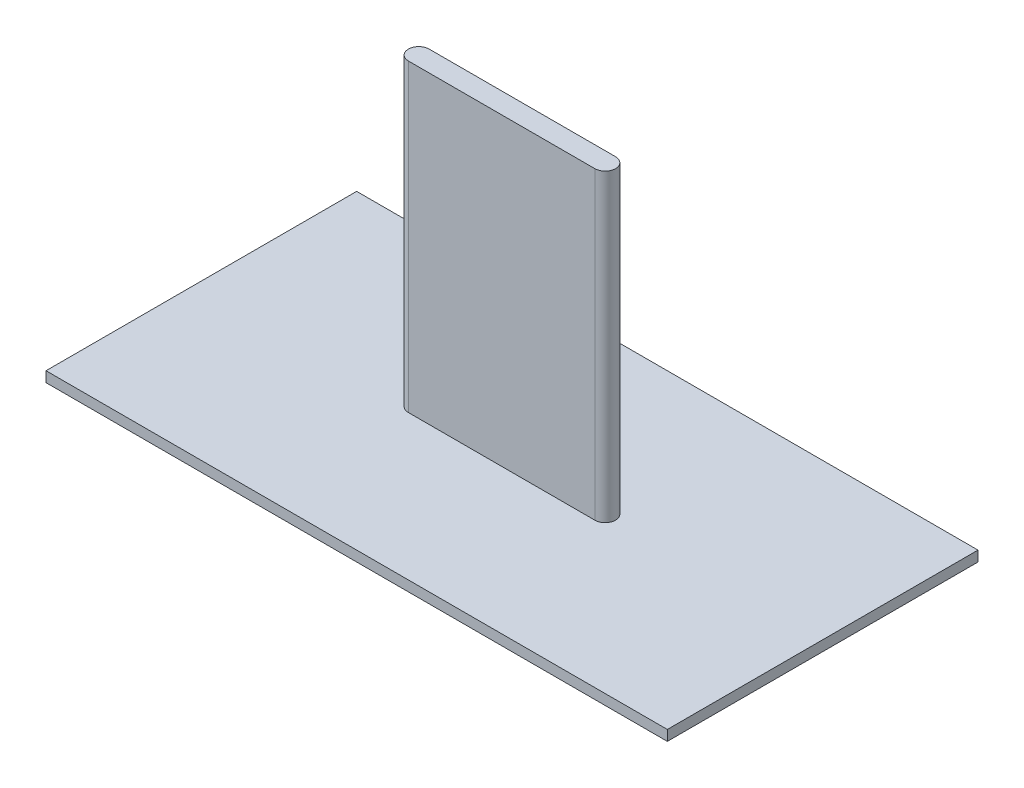
ISO-10303-21;
HEADER;
FILE_DESCRIPTION(('STEP AP214'),'2;1');
FILE_NAME('part.step','',(''),(''),'','','');
FILE_SCHEMA(('AUTOMOTIVE_DESIGN { 1 0 10303 214 1 1 1 1 }'));
ENDSEC;
DATA;
#1=APPLICATION_CONTEXT('core data for automotive mechanical design processes');
#2=APPLICATION_PROTOCOL_DEFINITION('international standard','automotive_design',2000,#1);
#3=PRODUCT_CONTEXT('',#1,'mechanical');
#4=PRODUCT('Part','Part','',(#3));
#5=PRODUCT_RELATED_PRODUCT_CATEGORY('part','',(#4));
#6=PRODUCT_DEFINITION_FORMATION('','',#4);
#7=PRODUCT_DEFINITION_CONTEXT('part definition',#1,'design');
#8=PRODUCT_DEFINITION('design','',#6,#7);
#9=PRODUCT_DEFINITION_SHAPE('','',#8);
#10=(LENGTH_UNIT() NAMED_UNIT(*) SI_UNIT(.MILLI.,.METRE.));
#11=(NAMED_UNIT(*) PLANE_ANGLE_UNIT() SI_UNIT($,.RADIAN.));
#12=(NAMED_UNIT(*) SI_UNIT($,.STERADIAN.) SOLID_ANGLE_UNIT());
#13=UNCERTAINTY_MEASURE_WITH_UNIT(LENGTH_MEASURE(1.E-05),#10,'distance_accuracy_value','');
#14=(GEOMETRIC_REPRESENTATION_CONTEXT(3) GLOBAL_UNCERTAINTY_ASSIGNED_CONTEXT((#13)) GLOBAL_UNIT_ASSIGNED_CONTEXT((#10,
#11,#12)) REPRESENTATION_CONTEXT('',''));
#15=CARTESIAN_POINT('',(0.,0.,0.));
#16=DIRECTION('',(0.,0.,1.));
#17=DIRECTION('',(1.,0.,0.));
#18=AXIS2_PLACEMENT_3D('',#15,#16,#17);
#19=CARTESIAN_POINT('',(0.,5.,0.));
#20=DIRECTION('',(0.,-1.,0.));
#21=DIRECTION('',(0.,0.,-1.));
#22=AXIS2_PLACEMENT_3D('',#19,#20,#21);
#23=PLANE('',#22);
#24=DIRECTION('',(0.,0.,-1.));
#25=VECTOR('',#24,1.);
#26=CARTESIAN_POINT('',(150.,5.,75.));
#27=LINE('',#26,#25);
#28=CARTESIAN_POINT('',(150.,5.,75.));
#29=VERTEX_POINT('',#28);
#30=CARTESIAN_POINT('',(150.,5.,-75.));
#31=VERTEX_POINT('',#30);
#32=EDGE_CURVE('E134',#29,#31,#27,.T.);
#33=ORIENTED_EDGE('',*,*,#32,.T.);
#34=DIRECTION('',(-1.,0.,0.));
#35=VECTOR('',#34,1.);
#36=CARTESIAN_POINT('',(-150.,5.,-75.));
#37=LINE('',#36,#35);
#38=CARTESIAN_POINT('',(-150.,5.,-75.));
#39=VERTEX_POINT('',#38);
#40=EDGE_CURVE('E137',#31,#39,#37,.T.);
#41=ORIENTED_EDGE('',*,*,#40,.T.);
#42=DIRECTION('',(0.,0.,1.));
#43=VECTOR('',#42,1.);
#44=CARTESIAN_POINT('',(-150.,5.,75.));
#45=LINE('',#44,#43);
#46=CARTESIAN_POINT('',(-150.,5.,75.));
#47=VERTEX_POINT('',#46);
#48=EDGE_CURVE('E140',#39,#47,#45,.T.);
#49=ORIENTED_EDGE('',*,*,#48,.T.);
#50=DIRECTION('',(1.,0.,0.));
#51=VECTOR('',#50,1.);
#52=CARTESIAN_POINT('',(-150.,5.,75.));
#53=LINE('',#52,#51);
#54=EDGE_CURVE('E142',#47,#29,#53,.T.);
#55=ORIENTED_EDGE('',*,*,#54,.T.);
#56=EDGE_LOOP('',(#33,#41,#49,#55));
#57=FACE_BOUND('',#56,.T.);
#58=CARTESIAN_POINT('',(-45.,5.,0.));
#59=DIRECTION('',(0.,1.,0.));
#60=DIRECTION('',(0.,0.,1.));
#61=AXIS2_PLACEMENT_3D('',#58,#59,#60);
#62=CIRCLE('',#61,5.);
#63=CARTESIAN_POINT('',(-45.,5.,-5.));
#64=VERTEX_POINT('',#63);
#65=CARTESIAN_POINT('',(-45.,5.,5.));
#66=VERTEX_POINT('',#65);
#67=EDGE_CURVE('E124',#64,#66,#62,.T.);
#68=ORIENTED_EDGE('',*,*,#67,.F.);
#69=DIRECTION('',(-1.,0.,0.));
#70=VECTOR('',#69,1.);
#71=CARTESIAN_POINT('',(-45.,5.,-5.));
#72=LINE('',#71,#70);
#73=CARTESIAN_POINT('',(45.,5.,-5.00000000000002));
#74=VERTEX_POINT('',#73);
#75=EDGE_CURVE('E121',#74,#64,#72,.T.);
#76=ORIENTED_EDGE('',*,*,#75,.F.);
#77=CARTESIAN_POINT('',(45.,5.,0.));
#78=DIRECTION('',(0.,1.,0.));
#79=DIRECTION('',(0.,0.,1.));
#80=AXIS2_PLACEMENT_3D('',#77,#78,#79);
#81=CIRCLE('',#80,5.);
#82=CARTESIAN_POINT('',(45.,5.,4.99999999999998));
#83=VERTEX_POINT('',#82);
#84=EDGE_CURVE('E59',#83,#74,#81,.T.);
#85=ORIENTED_EDGE('',*,*,#84,.F.);
#86=DIRECTION('',(1.,0.,0.));
#87=VECTOR('',#86,1.);
#88=CARTESIAN_POINT('',(-45.,5.,5.));
#89=LINE('',#88,#87);
#90=EDGE_CURVE('E54',#66,#83,#89,.T.);
#91=ORIENTED_EDGE('',*,*,#90,.F.);
#92=EDGE_LOOP('',(#68,#76,#85,#91));
#93=FACE_BOUND('',#92,.T.);
#94=ADVANCED_FACE('F39',(#57,#93),#23,.F.);
#95=CARTESIAN_POINT('',(150.,5.,75.));
#96=DIRECTION('',(-1.,0.,0.));
#97=DIRECTION('',(0.,0.,1.));
#98=AXIS2_PLACEMENT_3D('',#95,#96,#97);
#99=PLANE('',#98);
#100=DIRECTION('',(0.,0.,-1.));
#101=VECTOR('',#100,1.);
#102=CARTESIAN_POINT('',(150.,0.,75.));
#103=LINE('',#102,#101);
#104=CARTESIAN_POINT('',(150.,0.,75.));
#105=VERTEX_POINT('',#104);
#106=CARTESIAN_POINT('',(150.,0.,-75.));
#107=VERTEX_POINT('',#106);
#108=EDGE_CURVE('E125',#105,#107,#103,.T.);
#109=ORIENTED_EDGE('',*,*,#108,.T.);
#110=DIRECTION('',(0.,-1.,0.));
#111=VECTOR('',#110,1.);
#112=CARTESIAN_POINT('',(150.,5.,-75.));
#113=LINE('',#112,#111);
#114=EDGE_CURVE('E11',#31,#107,#113,.T.);
#115=ORIENTED_EDGE('',*,*,#114,.F.);
#116=ORIENTED_EDGE('',*,*,#32,.F.);
#117=DIRECTION('',(0.,-1.,0.));
#118=VECTOR('',#117,1.);
#119=CARTESIAN_POINT('',(150.,5.,75.));
#120=LINE('',#119,#118);
#121=EDGE_CURVE('E143',#29,#105,#120,.T.);
#122=ORIENTED_EDGE('',*,*,#121,.T.);
#123=EDGE_LOOP('',(#109,#115,#116,#122));
#124=FACE_BOUND('',#123,.T.);
#125=ADVANCED_FACE('F41',(#124),#99,.F.);
#126=CARTESIAN_POINT('',(-150.,5.,-75.));
#127=DIRECTION('',(0.,0.,1.));
#128=DIRECTION('',(1.,0.,0.));
#129=AXIS2_PLACEMENT_3D('',#126,#127,#128);
#130=PLANE('',#129);
#131=DIRECTION('',(-1.,0.,0.));
#132=VECTOR('',#131,1.);
#133=CARTESIAN_POINT('',(-150.,0.,-75.));
#134=LINE('',#133,#132);
#135=CARTESIAN_POINT('',(-150.,0.,-75.));
#136=VERTEX_POINT('',#135);
#137=EDGE_CURVE('E128',#107,#136,#134,.T.);
#138=ORIENTED_EDGE('',*,*,#137,.T.);
#139=DIRECTION('',(0.,-1.,0.));
#140=VECTOR('',#139,1.);
#141=CARTESIAN_POINT('',(-150.,5.,-75.));
#142=LINE('',#141,#140);
#143=EDGE_CURVE('E47',#39,#136,#142,.T.);
#144=ORIENTED_EDGE('',*,*,#143,.F.);
#145=ORIENTED_EDGE('',*,*,#40,.F.);
#146=ORIENTED_EDGE('',*,*,#114,.T.);
#147=EDGE_LOOP('',(#138,#144,#145,#146));
#148=FACE_BOUND('',#147,.T.);
#149=ADVANCED_FACE('F173',(#148),#130,.F.);
#150=CARTESIAN_POINT('',(-150.,5.,75.));
#151=DIRECTION('',(1.,0.,0.));
#152=DIRECTION('',(0.,0.,-1.));
#153=AXIS2_PLACEMENT_3D('',#150,#151,#152);
#154=PLANE('',#153);
#155=DIRECTION('',(0.,0.,1.));
#156=VECTOR('',#155,1.);
#157=CARTESIAN_POINT('',(-150.,0.,75.));
#158=LINE('',#157,#156);
#159=CARTESIAN_POINT('',(-150.,0.,75.));
#160=VERTEX_POINT('',#159);
#161=EDGE_CURVE('E146',#136,#160,#158,.T.);
#162=ORIENTED_EDGE('',*,*,#161,.T.);
#163=DIRECTION('',(0.,-1.,0.));
#164=VECTOR('',#163,1.);
#165=CARTESIAN_POINT('',(-150.,5.,75.));
#166=LINE('',#165,#164);
#167=EDGE_CURVE('E151',#47,#160,#166,.T.);
#168=ORIENTED_EDGE('',*,*,#167,.F.);
#169=ORIENTED_EDGE('',*,*,#48,.F.);
#170=ORIENTED_EDGE('',*,*,#143,.T.);
#171=EDGE_LOOP('',(#162,#168,#169,#170));
#172=FACE_BOUND('',#171,.T.);
#173=ADVANCED_FACE('F158',(#172),#154,.F.);
#174=CARTESIAN_POINT('',(-150.,5.,75.));
#175=DIRECTION('',(0.,0.,-1.));
#176=DIRECTION('',(-1.,0.,0.));
#177=AXIS2_PLACEMENT_3D('',#174,#175,#176);
#178=PLANE('',#177);
#179=DIRECTION('',(1.,0.,0.));
#180=VECTOR('',#179,1.);
#181=CARTESIAN_POINT('',(-150.,0.,75.));
#182=LINE('',#181,#180);
#183=EDGE_CURVE('E138',#160,#105,#182,.T.);
#184=ORIENTED_EDGE('',*,*,#183,.T.);
#185=ORIENTED_EDGE('',*,*,#121,.F.);
#186=ORIENTED_EDGE('',*,*,#54,.F.);
#187=ORIENTED_EDGE('',*,*,#167,.T.);
#188=EDGE_LOOP('',(#184,#185,#186,#187));
#189=FACE_BOUND('',#188,.T.);
#190=ADVANCED_FACE('F167',(#189),#178,.F.);
#191=CARTESIAN_POINT('',(0.,0.,0.));
#192=DIRECTION('',(0.,-1.,0.));
#193=DIRECTION('',(0.,0.,-1.));
#194=AXIS2_PLACEMENT_3D('',#191,#192,#193);
#195=PLANE('',#194);
#196=ORIENTED_EDGE('',*,*,#108,.F.);
#197=ORIENTED_EDGE('',*,*,#183,.F.);
#198=ORIENTED_EDGE('',*,*,#161,.F.);
#199=ORIENTED_EDGE('',*,*,#137,.F.);
#200=EDGE_LOOP('',(#196,#197,#198,#199));
#201=FACE_BOUND('',#200,.T.);
#202=ADVANCED_FACE('F164',(#201),#195,.T.);
#203=CARTESIAN_POINT('',(-45.,152.,0.));
#204=DIRECTION('',(0.,-1.,0.));
#205=DIRECTION('',(0.,0.,-1.));
#206=AXIS2_PLACEMENT_3D('',#203,#204,#205);
#207=CYLINDRICAL_SURFACE('',#206,5.);
#208=ORIENTED_EDGE('',*,*,#67,.T.);
#209=DIRECTION('',(0.,-1.,0.));
#210=VECTOR('',#209,1.);
#211=CARTESIAN_POINT('',(-45.,152.,5.));
#212=LINE('',#211,#210);
#213=CARTESIAN_POINT('',(-45.,152.,5.));
#214=VERTEX_POINT('',#213);
#215=EDGE_CURVE('E105',#214,#66,#212,.T.);
#216=ORIENTED_EDGE('',*,*,#215,.F.);
#217=CARTESIAN_POINT('',(-45.,152.,0.));
#218=DIRECTION('',(0.,1.,0.));
#219=DIRECTION('',(0.,0.,1.));
#220=AXIS2_PLACEMENT_3D('',#217,#218,#219);
#221=CIRCLE('',#220,5.);
#222=CARTESIAN_POINT('',(-45.,152.,-5.));
#223=VERTEX_POINT('',#222);
#224=EDGE_CURVE('E112',#223,#214,#221,.T.);
#225=ORIENTED_EDGE('',*,*,#224,.F.);
#226=DIRECTION('',(0.,-1.,0.));
#227=VECTOR('',#226,1.);
#228=CARTESIAN_POINT('',(-45.,152.,-5.));
#229=LINE('',#228,#227);
#230=EDGE_CURVE('E288',#223,#64,#229,.T.);
#231=ORIENTED_EDGE('',*,*,#230,.T.);
#232=EDGE_LOOP('',(#208,#216,#225,#231));
#233=FACE_BOUND('',#232,.T.);
#234=ADVANCED_FACE('F123',(#233),#207,.T.);
#235=CARTESIAN_POINT('',(-45.,152.,5.));
#236=DIRECTION('',(0.,0.,-1.));
#237=DIRECTION('',(-1.,0.,0.));
#238=AXIS2_PLACEMENT_3D('',#235,#236,#237);
#239=PLANE('',#238);
#240=ORIENTED_EDGE('',*,*,#90,.T.);
#241=DIRECTION('',(0.,-1.,0.));
#242=VECTOR('',#241,1.);
#243=CARTESIAN_POINT('',(45.,152.,4.99999999999998));
#244=LINE('',#243,#242);
#245=CARTESIAN_POINT('',(45.,152.,4.99999999999998));
#246=VERTEX_POINT('',#245);
#247=EDGE_CURVE('E108',#246,#83,#244,.T.);
#248=ORIENTED_EDGE('',*,*,#247,.F.);
#249=DIRECTION('',(1.,0.,0.));
#250=VECTOR('',#249,1.);
#251=CARTESIAN_POINT('',(-45.,152.,5.));
#252=LINE('',#251,#250);
#253=EDGE_CURVE('E101',#214,#246,#252,.T.);
#254=ORIENTED_EDGE('',*,*,#253,.F.);
#255=ORIENTED_EDGE('',*,*,#215,.T.);
#256=EDGE_LOOP('',(#240,#248,#254,#255));
#257=FACE_BOUND('',#256,.T.);
#258=ADVANCED_FACE('F103',(#257),#239,.F.);
#259=CARTESIAN_POINT('',(45.,152.,0.));
#260=DIRECTION('',(0.,-1.,0.));
#261=DIRECTION('',(0.,0.,-1.));
#262=AXIS2_PLACEMENT_3D('',#259,#260,#261);
#263=CYLINDRICAL_SURFACE('',#262,5.);
#264=ORIENTED_EDGE('',*,*,#84,.T.);
#265=DIRECTION('',(0.,-1.,0.));
#266=VECTOR('',#265,1.);
#267=CARTESIAN_POINT('',(45.,152.,-5.00000000000002));
#268=LINE('',#267,#266);
#269=CARTESIAN_POINT('',(45.,152.,-5.00000000000002));
#270=VERTEX_POINT('',#269);
#271=EDGE_CURVE('E130',#270,#74,#268,.T.);
#272=ORIENTED_EDGE('',*,*,#271,.F.);
#273=CARTESIAN_POINT('',(45.,152.,0.));
#274=DIRECTION('',(0.,1.,0.));
#275=DIRECTION('',(0.,0.,1.));
#276=AXIS2_PLACEMENT_3D('',#273,#274,#275);
#277=CIRCLE('',#276,5.);
#278=EDGE_CURVE('E111',#246,#270,#277,.T.);
#279=ORIENTED_EDGE('',*,*,#278,.F.);
#280=ORIENTED_EDGE('',*,*,#247,.T.);
#281=EDGE_LOOP('',(#264,#272,#279,#280));
#282=FACE_BOUND('',#281,.T.);
#283=ADVANCED_FACE('F214',(#282),#263,.T.);
#284=CARTESIAN_POINT('',(-45.,152.,-5.));
#285=DIRECTION('',(0.,0.,1.));
#286=DIRECTION('',(1.,0.,0.));
#287=AXIS2_PLACEMENT_3D('',#284,#285,#286);
#288=PLANE('',#287);
#289=ORIENTED_EDGE('',*,*,#75,.T.);
#290=ORIENTED_EDGE('',*,*,#230,.F.);
#291=DIRECTION('',(-1.,0.,0.));
#292=VECTOR('',#291,1.);
#293=CARTESIAN_POINT('',(-45.,152.,-5.));
#294=LINE('',#293,#292);
#295=EDGE_CURVE('E117',#270,#223,#294,.T.);
#296=ORIENTED_EDGE('',*,*,#295,.F.);
#297=ORIENTED_EDGE('',*,*,#271,.T.);
#298=EDGE_LOOP('',(#289,#290,#296,#297));
#299=FACE_BOUND('',#298,.T.);
#300=ADVANCED_FACE('F220',(#299),#288,.F.);
#301=CARTESIAN_POINT('',(-45.,152.,0.));
#302=DIRECTION('',(0.,1.,0.));
#303=DIRECTION('',(0.,0.,1.));
#304=AXIS2_PLACEMENT_3D('',#301,#302,#303);
#305=PLANE('',#304);
#306=ORIENTED_EDGE('',*,*,#224,.T.);
#307=ORIENTED_EDGE('',*,*,#253,.T.);
#308=ORIENTED_EDGE('',*,*,#278,.T.);
#309=ORIENTED_EDGE('',*,*,#295,.T.);
#310=EDGE_LOOP('',(#306,#307,#308,#309));
#311=FACE_BOUND('',#310,.T.);
#312=ADVANCED_FACE('F115',(#311),#305,.T.);
#313=CLOSED_SHELL('',(#94,#125,#149,#173,#190,#202,#234,#258,#283,#300,#312));
#314=MANIFOLD_SOLID_BREP('B2',#313);
#315=ADVANCED_BREP_SHAPE_REPRESENTATION('',(#18,#314),#14);
#316=SHAPE_DEFINITION_REPRESENTATION(#9,#315);
ENDSEC;
END-ISO-10303-21;
